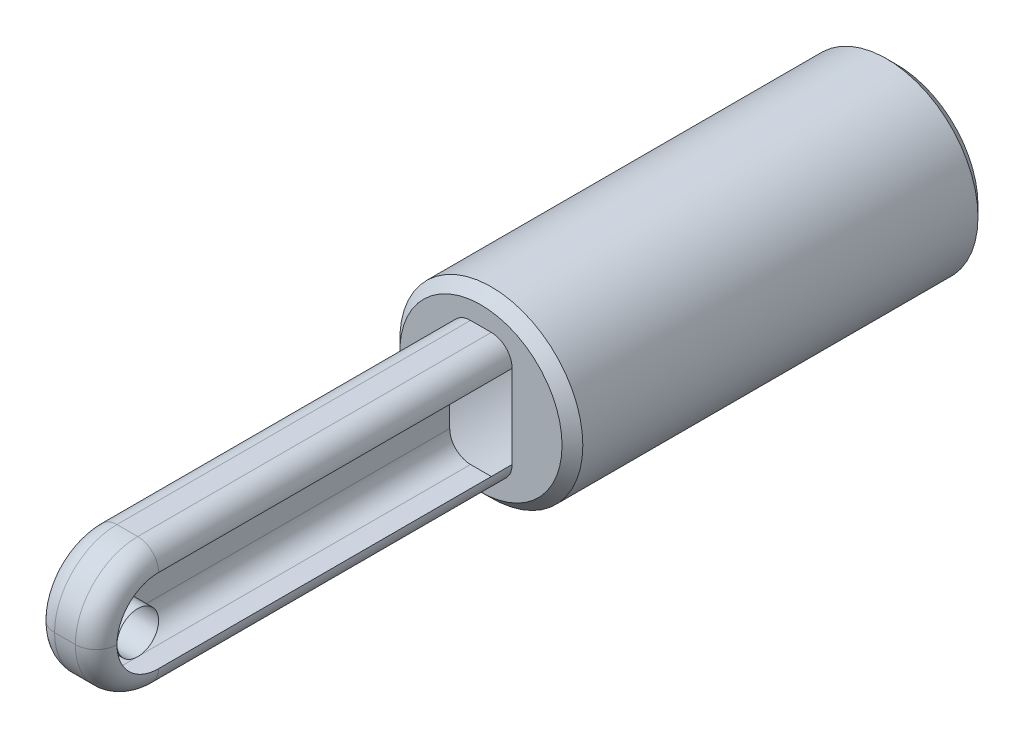
ISO-10303-21;
HEADER;
FILE_DESCRIPTION(('STEP AP214'),'2;1');
FILE_NAME('part.step','',(''),(''),'','','');
FILE_SCHEMA(('AUTOMOTIVE_DESIGN { 1 0 10303 214 1 1 1 1 }'));
ENDSEC;
DATA;
#1=APPLICATION_CONTEXT('core data for automotive mechanical design processes');
#2=APPLICATION_PROTOCOL_DEFINITION('international standard','automotive_design',2000,#1);
#3=PRODUCT_CONTEXT('',#1,'mechanical');
#4=PRODUCT('Part','Part','',(#3));
#5=PRODUCT_RELATED_PRODUCT_CATEGORY('part','',(#4));
#6=PRODUCT_DEFINITION_FORMATION('','',#4);
#7=PRODUCT_DEFINITION_CONTEXT('part definition',#1,'design');
#8=PRODUCT_DEFINITION('design','',#6,#7);
#9=PRODUCT_DEFINITION_SHAPE('','',#8);
#10=(LENGTH_UNIT() NAMED_UNIT(*) SI_UNIT(.MILLI.,.METRE.));
#11=(NAMED_UNIT(*) PLANE_ANGLE_UNIT() SI_UNIT($,.RADIAN.));
#12=(NAMED_UNIT(*) SI_UNIT($,.STERADIAN.) SOLID_ANGLE_UNIT());
#13=UNCERTAINTY_MEASURE_WITH_UNIT(LENGTH_MEASURE(1.E-05),#10,'distance_accuracy_value','');
#14=(GEOMETRIC_REPRESENTATION_CONTEXT(3) GLOBAL_UNCERTAINTY_ASSIGNED_CONTEXT((#13)) GLOBAL_UNIT_ASSIGNED_CONTEXT((#10,
#11,#12)) REPRESENTATION_CONTEXT('',''));
#15=CARTESIAN_POINT('',(0.,0.,0.));
#16=DIRECTION('',(0.,0.,1.));
#17=DIRECTION('',(1.,0.,0.));
#18=AXIS2_PLACEMENT_3D('',#15,#16,#17);
#19=CARTESIAN_POINT('',(0.,0.,0.));
#20=DIRECTION('',(0.,0.,1.));
#21=DIRECTION('',(1.,0.,0.));
#22=AXIS2_PLACEMENT_3D('',#19,#20,#21);
#23=PLANE('',#22);
#24=CARTESIAN_POINT('',(0.,0.,0.));
#25=DIRECTION('',(0.,0.,1.));
#26=DIRECTION('',(1.,0.,0.));
#27=AXIS2_PLACEMENT_3D('',#24,#25,#26);
#28=CIRCLE('',#27,19.5);
#29=CARTESIAN_POINT('',(19.5,0.,0.));
#30=VERTEX_POINT('',#29);
#31=EDGE_CURVE('E11',#30,#30,#28,.T.);
#32=ORIENTED_EDGE('',*,*,#31,.T.);
#33=EDGE_LOOP('',(#32));
#34=FACE_BOUND('',#33,.T.);
#35=DIRECTION('',(-1.,0.,0.));
#36=VECTOR('',#35,1.);
#37=CARTESIAN_POINT('',(7.5,15.,0.));
#38=LINE('',#37,#36);
#39=CARTESIAN_POINT('',(2.5,15.,0.));
#40=VERTEX_POINT('',#39);
#41=CARTESIAN_POINT('',(-2.5,15.,0.));
#42=VERTEX_POINT('',#41);
#43=EDGE_CURVE('E135',#40,#42,#38,.T.);
#44=ORIENTED_EDGE('',*,*,#43,.F.);
#45=CARTESIAN_POINT('',(2.5,10.,0.));
#46=DIRECTION('',(0.,0.,1.));
#47=DIRECTION('',(1.,0.,0.));
#48=AXIS2_PLACEMENT_3D('',#45,#46,#47);
#49=CIRCLE('',#48,5.);
#50=CARTESIAN_POINT('',(7.5,10.,0.));
#51=VERTEX_POINT('',#50);
#52=EDGE_CURVE('E165',#40,#51,#49,.F.);
#53=ORIENTED_EDGE('',*,*,#52,.T.);
#54=DIRECTION('',(0.,1.,0.));
#55=VECTOR('',#54,1.);
#56=CARTESIAN_POINT('',(7.5,15.,0.));
#57=LINE('',#56,#55);
#58=CARTESIAN_POINT('',(7.5,-10.,0.));
#59=VERTEX_POINT('',#58);
#60=EDGE_CURVE('E225',#59,#51,#57,.T.);
#61=ORIENTED_EDGE('',*,*,#60,.F.);
#62=CARTESIAN_POINT('',(2.5,-10.,0.));
#63=DIRECTION('',(0.,0.,1.));
#64=DIRECTION('',(1.,0.,0.));
#65=AXIS2_PLACEMENT_3D('',#62,#63,#64);
#66=CIRCLE('',#65,5.);
#67=CARTESIAN_POINT('',(2.5,-15.,0.));
#68=VERTEX_POINT('',#67);
#69=EDGE_CURVE('E200',#59,#68,#66,.F.);
#70=ORIENTED_EDGE('',*,*,#69,.T.);
#71=DIRECTION('',(-1.,0.,0.));
#72=VECTOR('',#71,1.);
#73=CARTESIAN_POINT('',(7.5,-15.,0.));
#74=LINE('',#73,#72);
#75=CARTESIAN_POINT('',(-2.5,-15.,0.));
#76=VERTEX_POINT('',#75);
#77=EDGE_CURVE('E121',#68,#76,#74,.T.);
#78=ORIENTED_EDGE('',*,*,#77,.T.);
#79=CARTESIAN_POINT('',(-2.5,-10.,0.));
#80=DIRECTION('',(0.,0.,1.));
#81=DIRECTION('',(1.,0.,0.));
#82=AXIS2_PLACEMENT_3D('',#79,#80,#81);
#83=CIRCLE('',#82,5.);
#84=CARTESIAN_POINT('',(-7.5,-10.,0.));
#85=VERTEX_POINT('',#84);
#86=EDGE_CURVE('E254',#76,#85,#83,.F.);
#87=ORIENTED_EDGE('',*,*,#86,.T.);
#88=DIRECTION('',(0.,1.,0.));
#89=VECTOR('',#88,1.);
#90=CARTESIAN_POINT('',(-7.5,15.,0.));
#91=LINE('',#90,#89);
#92=CARTESIAN_POINT('',(-7.5,10.,0.));
#93=VERTEX_POINT('',#92);
#94=EDGE_CURVE('E227',#85,#93,#91,.T.);
#95=ORIENTED_EDGE('',*,*,#94,.T.);
#96=CARTESIAN_POINT('',(-2.5,10.,0.));
#97=DIRECTION('',(0.,0.,1.));
#98=DIRECTION('',(1.,0.,0.));
#99=AXIS2_PLACEMENT_3D('',#96,#97,#98);
#100=CIRCLE('',#99,5.);
#101=EDGE_CURVE('E49',#93,#42,#100,.F.);
#102=ORIENTED_EDGE('',*,*,#101,.T.);
#103=EDGE_LOOP('',(#44,#53,#61,#70,#78,#87,#95,#102));
#104=FACE_BOUND('',#103,.T.);
#105=ADVANCED_FACE('F34',(#34,#104),#23,.T.);
#106=CARTESIAN_POINT('',(0.,0.,-100.));
#107=DIRECTION('',(0.,0.,1.));
#108=DIRECTION('',(1.,0.,0.));
#109=AXIS2_PLACEMENT_3D('',#106,#107,#108);
#110=CYLINDRICAL_SURFACE('',#109,22.);
#111=CARTESIAN_POINT('',(0.,0.,-97.5));
#112=DIRECTION('',(0.,0.,1.));
#113=DIRECTION('',(1.,0.,0.));
#114=AXIS2_PLACEMENT_3D('',#111,#112,#113);
#115=CIRCLE('',#114,22.);
#116=CARTESIAN_POINT('',(22.,0.,-97.5));
#117=VERTEX_POINT('',#116);
#118=EDGE_CURVE('E164',#117,#117,#115,.T.);
#119=ORIENTED_EDGE('',*,*,#118,.T.);
#120=EDGE_LOOP('',(#119));
#121=FACE_BOUND('',#120,.T.);
#122=CARTESIAN_POINT('',(0.,0.,-2.5));
#123=DIRECTION('',(0.,0.,1.));
#124=DIRECTION('',(1.,0.,0.));
#125=AXIS2_PLACEMENT_3D('',#122,#123,#124);
#126=CIRCLE('',#125,22.);
#127=CARTESIAN_POINT('',(22.,0.,-2.5));
#128=VERTEX_POINT('',#127);
#129=EDGE_CURVE('E161',#128,#128,#126,.F.);
#130=ORIENTED_EDGE('',*,*,#129,.T.);
#131=EDGE_LOOP('',(#130));
#132=FACE_BOUND('',#131,.T.);
#133=ADVANCED_FACE('F177',(#121,#132),#110,.T.);
#134=CARTESIAN_POINT('',(0.,0.,-100.));
#135=DIRECTION('',(0.,0.,1.));
#136=DIRECTION('',(1.,0.,0.));
#137=AXIS2_PLACEMENT_3D('',#134,#135,#136);
#138=PLANE('',#137);
#139=CARTESIAN_POINT('',(0.,0.,-100.));
#140=DIRECTION('',(0.,0.,1.));
#141=DIRECTION('',(1.,0.,0.));
#142=AXIS2_PLACEMENT_3D('',#139,#140,#141);
#143=CIRCLE('',#142,19.5);
#144=CARTESIAN_POINT('',(19.5,0.,-100.));
#145=VERTEX_POINT('',#144);
#146=EDGE_CURVE('E42',#145,#145,#143,.F.);
#147=ORIENTED_EDGE('',*,*,#146,.T.);
#148=EDGE_LOOP('',(#147));
#149=FACE_BOUND('',#148,.T.);
#150=ADVANCED_FACE('F170',(#149),#138,.F.);
#151=CARTESIAN_POINT('',(7.5,15.,0.));
#152=DIRECTION('',(0.,-1.,0.));
#153=DIRECTION('',(0.,0.,-1.));
#154=AXIS2_PLACEMENT_3D('',#151,#152,#153);
#155=PLANE('',#154);
#156=ORIENTED_EDGE('',*,*,#43,.T.);
#157=DIRECTION('',(0.,0.,1.));
#158=VECTOR('',#157,1.);
#159=CARTESIAN_POINT('',(-2.5,15.,85.));
#160=LINE('',#159,#158);
#161=CARTESIAN_POINT('',(-2.5,15.,85.));
#162=VERTEX_POINT('',#161);
#163=EDGE_CURVE('E252',#42,#162,#160,.T.);
#164=ORIENTED_EDGE('',*,*,#163,.T.);
#165=DIRECTION('',(-1.,0.,0.));
#166=VECTOR('',#165,1.);
#167=CARTESIAN_POINT('',(7.5,15.,85.));
#168=LINE('',#167,#166);
#169=CARTESIAN_POINT('',(2.5,15.,85.));
#170=VERTEX_POINT('',#169);
#171=EDGE_CURVE('E125',#162,#170,#168,.F.);
#172=ORIENTED_EDGE('',*,*,#171,.T.);
#173=DIRECTION('',(0.,0.,1.));
#174=VECTOR('',#173,1.);
#175=CARTESIAN_POINT('',(2.5,15.,0.));
#176=LINE('',#175,#174);
#177=EDGE_CURVE('E56',#170,#40,#176,.F.);
#178=ORIENTED_EDGE('',*,*,#177,.T.);
#179=EDGE_LOOP('',(#156,#164,#172,#178));
#180=FACE_BOUND('',#179,.T.);
#181=ADVANCED_FACE('F264',(#180),#155,.F.);
#182=CARTESIAN_POINT('',(7.5,-15.,0.));
#183=DIRECTION('',(0.,1.,0.));
#184=DIRECTION('',(0.,0.,1.));
#185=AXIS2_PLACEMENT_3D('',#182,#183,#184);
#186=PLANE('',#185);
#187=DIRECTION('',(-1.,0.,0.));
#188=VECTOR('',#187,1.);
#189=CARTESIAN_POINT('',(7.5,-15.,85.));
#190=LINE('',#189,#188);
#191=CARTESIAN_POINT('',(2.5,-15.,85.));
#192=VERTEX_POINT('',#191);
#193=CARTESIAN_POINT('',(-2.5,-15.,85.));
#194=VERTEX_POINT('',#193);
#195=EDGE_CURVE('E118',#192,#194,#190,.T.);
#196=ORIENTED_EDGE('',*,*,#195,.T.);
#197=DIRECTION('',(0.,0.,-1.));
#198=VECTOR('',#197,1.);
#199=CARTESIAN_POINT('',(-2.5,-15.,0.));
#200=LINE('',#199,#198);
#201=EDGE_CURVE('E124',#194,#76,#200,.T.);
#202=ORIENTED_EDGE('',*,*,#201,.T.);
#203=ORIENTED_EDGE('',*,*,#77,.F.);
#204=DIRECTION('',(0.,0.,-1.));
#205=VECTOR('',#204,1.);
#206=CARTESIAN_POINT('',(2.5,-15.,0.));
#207=LINE('',#206,#205);
#208=EDGE_CURVE('E114',#68,#192,#207,.F.);
#209=ORIENTED_EDGE('',*,*,#208,.T.);
#210=EDGE_LOOP('',(#196,#202,#203,#209));
#211=FACE_BOUND('',#210,.T.);
#212=ADVANCED_FACE('F116',(#211),#186,.F.);
#213=CARTESIAN_POINT('',(7.5,0.,0.));
#214=DIRECTION('',(-1.,0.,0.));
#215=DIRECTION('',(0.,0.,1.));
#216=AXIS2_PLACEMENT_3D('',#213,#214,#215);
#217=PLANE('',#216);
#218=CARTESIAN_POINT('',(7.5,0.,85.));
#219=DIRECTION('',(-1.,0.,0.));
#220=DIRECTION('',(0.,0.,1.));
#221=AXIS2_PLACEMENT_3D('',#218,#219,#220);
#222=CIRCLE('',#221,10.);
#223=CARTESIAN_POINT('',(7.5,0.,95.));
#224=VERTEX_POINT('',#223);
#225=CARTESIAN_POINT('',(7.5,-10.,85.));
#226=VERTEX_POINT('',#225);
#227=EDGE_CURVE('E248',#224,#226,#222,.F.);
#228=ORIENTED_EDGE('',*,*,#227,.T.);
#229=DIRECTION('',(0.,0.,-1.));
#230=VECTOR('',#229,1.);
#231=CARTESIAN_POINT('',(7.5,-10.,0.));
#232=LINE('',#231,#230);
#233=EDGE_CURVE('E150',#226,#59,#232,.T.);
#234=ORIENTED_EDGE('',*,*,#233,.T.);
#235=ORIENTED_EDGE('',*,*,#60,.T.);
#236=DIRECTION('',(0.,0.,1.));
#237=VECTOR('',#236,1.);
#238=CARTESIAN_POINT('',(7.5,10.,0.));
#239=LINE('',#238,#237);
#240=CARTESIAN_POINT('',(7.5,9.99999999999999,85.));
#241=VERTEX_POINT('',#240);
#242=EDGE_CURVE('E198',#51,#241,#239,.T.);
#243=ORIENTED_EDGE('',*,*,#242,.T.);
#244=CARTESIAN_POINT('',(7.5,0.,85.));
#245=DIRECTION('',(-1.,0.,0.));
#246=DIRECTION('',(0.,0.,1.));
#247=AXIS2_PLACEMENT_3D('',#244,#245,#246);
#248=CIRCLE('',#247,10.);
#249=EDGE_CURVE('E246',#241,#224,#248,.F.);
#250=ORIENTED_EDGE('',*,*,#249,.T.);
#251=CARTESIAN_POINT('',(7.5,0.,90.));
#252=DIRECTION('',(1.,0.,0.));
#253=DIRECTION('',(0.,0.,-1.));
#254=AXIS2_PLACEMENT_3D('',#251,#252,#253);
#255=CIRCLE('',#254,5.);
#256=EDGE_CURVE('E211',#224,#224,#255,.T.);
#257=ORIENTED_EDGE('',*,*,#256,.F.);
#258=EDGE_LOOP('',(#228,#234,#235,#243,#250,#257));
#259=FACE_BOUND('',#258,.T.);
#260=ADVANCED_FACE('F256',(#259),#217,.F.);
#261=CARTESIAN_POINT('',(-7.5,0.,0.));
#262=DIRECTION('',(-1.,0.,0.));
#263=DIRECTION('',(0.,0.,1.));
#264=AXIS2_PLACEMENT_3D('',#261,#262,#263);
#265=PLANE('',#264);
#266=ORIENTED_EDGE('',*,*,#94,.F.);
#267=DIRECTION('',(0.,0.,-1.));
#268=VECTOR('',#267,1.);
#269=CARTESIAN_POINT('',(-7.5,-10.,85.));
#270=LINE('',#269,#268);
#271=CARTESIAN_POINT('',(-7.5,-10.,85.));
#272=VERTEX_POINT('',#271);
#273=EDGE_CURVE('E146',#85,#272,#270,.F.);
#274=ORIENTED_EDGE('',*,*,#273,.T.);
#275=CARTESIAN_POINT('',(-7.5,0.,85.));
#276=DIRECTION('',(-1.,0.,0.));
#277=DIRECTION('',(0.,0.,1.));
#278=AXIS2_PLACEMENT_3D('',#275,#276,#277);
#279=CIRCLE('',#278,10.);
#280=CARTESIAN_POINT('',(-7.5,0.,95.));
#281=VERTEX_POINT('',#280);
#282=EDGE_CURVE('E237',#272,#281,#279,.T.);
#283=ORIENTED_EDGE('',*,*,#282,.T.);
#284=CARTESIAN_POINT('',(-7.5,0.,90.));
#285=DIRECTION('',(-1.,0.,0.));
#286=DIRECTION('',(0.,0.,1.));
#287=AXIS2_PLACEMENT_3D('',#284,#285,#286);
#288=CIRCLE('',#287,5.);
#289=EDGE_CURVE('E217',#281,#281,#288,.T.);
#290=ORIENTED_EDGE('',*,*,#289,.F.);
#291=CARTESIAN_POINT('',(-7.5,0.,85.));
#292=DIRECTION('',(-1.,0.,0.));
#293=DIRECTION('',(0.,0.,1.));
#294=AXIS2_PLACEMENT_3D('',#291,#292,#293);
#295=CIRCLE('',#294,10.);
#296=CARTESIAN_POINT('',(-7.5,9.99999999999999,85.));
#297=VERTEX_POINT('',#296);
#298=EDGE_CURVE('E235',#281,#297,#295,.T.);
#299=ORIENTED_EDGE('',*,*,#298,.T.);
#300=DIRECTION('',(0.,0.,1.));
#301=VECTOR('',#300,1.);
#302=CARTESIAN_POINT('',(-7.5,10.,0.));
#303=LINE('',#302,#301);
#304=EDGE_CURVE('E233',#297,#93,#303,.F.);
#305=ORIENTED_EDGE('',*,*,#304,.T.);
#306=EDGE_LOOP('',(#266,#274,#283,#290,#299,#305));
#307=FACE_BOUND('',#306,.T.);
#308=ADVANCED_FACE('F276',(#307),#265,.T.);
#309=CARTESIAN_POINT('',(7.5,0.,85.));
#310=DIRECTION('',(-1.,0.,0.));
#311=DIRECTION('',(0.,0.,1.));
#312=AXIS2_PLACEMENT_3D('',#309,#310,#311);
#313=CYLINDRICAL_SURFACE('',#312,15.);
#314=ORIENTED_EDGE('',*,*,#171,.F.);
#315=CARTESIAN_POINT('',(-2.5,0.,85.));
#316=DIRECTION('',(-1.,0.,0.));
#317=DIRECTION('',(0.,0.,1.));
#318=AXIS2_PLACEMENT_3D('',#315,#316,#317);
#319=CIRCLE('',#318,15.);
#320=CARTESIAN_POINT('',(-2.5,0.,100.));
#321=VERTEX_POINT('',#320);
#322=EDGE_CURVE('E243',#162,#321,#319,.F.);
#323=ORIENTED_EDGE('',*,*,#322,.T.);
#324=DIRECTION('',(-1.,0.,0.));
#325=VECTOR('',#324,1.);
#326=CARTESIAN_POINT('',(7.5,0.,100.));
#327=LINE('',#326,#325);
#328=CARTESIAN_POINT('',(2.5,0.,100.));
#329=VERTEX_POINT('',#328);
#330=EDGE_CURVE('E222',#329,#321,#327,.T.);
#331=ORIENTED_EDGE('',*,*,#330,.F.);
#332=CARTESIAN_POINT('',(2.5,0.,85.));
#333=DIRECTION('',(-1.,0.,0.));
#334=DIRECTION('',(0.,0.,1.));
#335=AXIS2_PLACEMENT_3D('',#332,#333,#334);
#336=CIRCLE('',#335,15.);
#337=EDGE_CURVE('E241',#329,#170,#336,.T.);
#338=ORIENTED_EDGE('',*,*,#337,.T.);
#339=EDGE_LOOP('',(#314,#323,#331,#338));
#340=FACE_BOUND('',#339,.T.);
#341=ADVANCED_FACE('F263',(#340),#313,.T.);
#342=CARTESIAN_POINT('',(7.5,0.,85.));
#343=DIRECTION('',(-1.,0.,0.));
#344=DIRECTION('',(0.,0.,1.));
#345=AXIS2_PLACEMENT_3D('',#342,#343,#344);
#346=CYLINDRICAL_SURFACE('',#345,15.);
#347=ORIENTED_EDGE('',*,*,#330,.T.);
#348=CARTESIAN_POINT('',(-2.5,0.,85.));
#349=DIRECTION('',(-1.,0.,0.));
#350=DIRECTION('',(0.,0.,1.));
#351=AXIS2_PLACEMENT_3D('',#348,#349,#350);
#352=CIRCLE('',#351,15.);
#353=EDGE_CURVE('E134',#321,#194,#352,.F.);
#354=ORIENTED_EDGE('',*,*,#353,.T.);
#355=ORIENTED_EDGE('',*,*,#195,.F.);
#356=CARTESIAN_POINT('',(2.5,0.,85.));
#357=DIRECTION('',(-1.,0.,0.));
#358=DIRECTION('',(0.,0.,1.));
#359=AXIS2_PLACEMENT_3D('',#356,#357,#358);
#360=CIRCLE('',#359,15.);
#361=EDGE_CURVE('E131',#192,#329,#360,.T.);
#362=ORIENTED_EDGE('',*,*,#361,.T.);
#363=EDGE_LOOP('',(#347,#354,#355,#362));
#364=FACE_BOUND('',#363,.T.);
#365=ADVANCED_FACE('F130',(#364),#346,.T.);
#366=CARTESIAN_POINT('',(-22.,0.,90.));
#367=DIRECTION('',(1.,0.,0.));
#368=DIRECTION('',(0.,0.,-1.));
#369=AXIS2_PLACEMENT_3D('',#366,#367,#368);
#370=CYLINDRICAL_SURFACE('',#369,5.);
#371=ORIENTED_EDGE('',*,*,#289,.T.);
#372=EDGE_LOOP('',(#371));
#373=FACE_BOUND('',#372,.T.);
#374=ORIENTED_EDGE('',*,*,#256,.T.);
#375=EDGE_LOOP('',(#374));
#376=FACE_BOUND('',#375,.T.);
#377=ADVANCED_FACE('F279',(#373,#376),#370,.F.);
#378=CARTESIAN_POINT('',(-2.5,10.,0.));
#379=DIRECTION('',(0.,0.,-1.));
#380=DIRECTION('',(0.,1.,0.));
#381=AXIS2_PLACEMENT_3D('',#378,#379,#380);
#382=CYLINDRICAL_SURFACE('',#381,5.);
#383=ORIENTED_EDGE('',*,*,#101,.F.);
#384=ORIENTED_EDGE('',*,*,#304,.F.);
#385=CARTESIAN_POINT('',(-2.5,9.99999999999999,85.));
#386=DIRECTION('',(0.,0.,1.));
#387=DIRECTION('',(1.,0.,0.));
#388=AXIS2_PLACEMENT_3D('',#385,#386,#387);
#389=CIRCLE('',#388,5.);
#390=EDGE_CURVE('E155',#162,#297,#389,.T.);
#391=ORIENTED_EDGE('',*,*,#390,.F.);
#392=ORIENTED_EDGE('',*,*,#163,.F.);
#393=EDGE_LOOP('',(#383,#384,#391,#392));
#394=FACE_BOUND('',#393,.T.);
#395=ADVANCED_FACE('F266',(#394),#382,.T.);
#396=CARTESIAN_POINT('',(-2.5,0.,85.));
#397=DIRECTION('',(-1.,0.,0.));
#398=DIRECTION('',(0.,0.,1.));
#399=AXIS2_PLACEMENT_3D('',#396,#397,#398);
#400=TOROIDAL_SURFACE('',#399,10.,5.);
#401=ORIENTED_EDGE('',*,*,#390,.T.);
#402=ORIENTED_EDGE('',*,*,#298,.F.);
#403=CARTESIAN_POINT('',(-2.5,0.,95.));
#404=DIRECTION('',(0.,-1.,0.));
#405=DIRECTION('',(1.,0.,0.));
#406=AXIS2_PLACEMENT_3D('',#403,#404,#405);
#407=CIRCLE('',#406,5.);
#408=EDGE_CURVE('E205',#321,#281,#407,.T.);
#409=ORIENTED_EDGE('',*,*,#408,.F.);
#410=ORIENTED_EDGE('',*,*,#322,.F.);
#411=EDGE_LOOP('',(#401,#402,#409,#410));
#412=FACE_BOUND('',#411,.T.);
#413=ADVANCED_FACE('F268',(#412),#400,.T.);
#414=CARTESIAN_POINT('',(-2.5,0.,85.));
#415=DIRECTION('',(-1.,0.,0.));
#416=DIRECTION('',(0.,0.,1.));
#417=AXIS2_PLACEMENT_3D('',#414,#415,#416);
#418=TOROIDAL_SURFACE('',#417,10.,5.);
#419=ORIENTED_EDGE('',*,*,#408,.T.);
#420=ORIENTED_EDGE('',*,*,#282,.F.);
#421=CARTESIAN_POINT('',(-2.5,-10.,85.));
#422=DIRECTION('',(0.,0.,-1.));
#423=DIRECTION('',(-1.,0.,0.));
#424=AXIS2_PLACEMENT_3D('',#421,#422,#423);
#425=CIRCLE('',#424,5.);
#426=EDGE_CURVE('E160',#194,#272,#425,.T.);
#427=ORIENTED_EDGE('',*,*,#426,.F.);
#428=ORIENTED_EDGE('',*,*,#353,.F.);
#429=EDGE_LOOP('',(#419,#420,#427,#428));
#430=FACE_BOUND('',#429,.T.);
#431=ADVANCED_FACE('F269',(#430),#418,.T.);
#432=CARTESIAN_POINT('',(-2.5,-10.,0.));
#433=DIRECTION('',(0.,0.,1.));
#434=DIRECTION('',(0.,-1.,0.));
#435=AXIS2_PLACEMENT_3D('',#432,#433,#434);
#436=CYLINDRICAL_SURFACE('',#435,5.);
#437=ORIENTED_EDGE('',*,*,#426,.T.);
#438=ORIENTED_EDGE('',*,*,#273,.F.);
#439=ORIENTED_EDGE('',*,*,#86,.F.);
#440=ORIENTED_EDGE('',*,*,#201,.F.);
#441=EDGE_LOOP('',(#437,#438,#439,#440));
#442=FACE_BOUND('',#441,.T.);
#443=ADVANCED_FACE('F273',(#442),#436,.T.);
#444=CARTESIAN_POINT('',(2.5,10.,0.));
#445=DIRECTION('',(0.,0.,1.));
#446=DIRECTION('',(0.,-1.,0.));
#447=AXIS2_PLACEMENT_3D('',#444,#445,#446);
#448=CYLINDRICAL_SURFACE('',#447,5.);
#449=ORIENTED_EDGE('',*,*,#52,.F.);
#450=ORIENTED_EDGE('',*,*,#177,.F.);
#451=CARTESIAN_POINT('',(2.5,9.99999999999999,85.));
#452=DIRECTION('',(0.,0.,1.));
#453=DIRECTION('',(1.,0.,0.));
#454=AXIS2_PLACEMENT_3D('',#451,#452,#453);
#455=CIRCLE('',#454,5.);
#456=EDGE_CURVE('E152',#241,#170,#455,.T.);
#457=ORIENTED_EDGE('',*,*,#456,.F.);
#458=ORIENTED_EDGE('',*,*,#242,.F.);
#459=EDGE_LOOP('',(#449,#450,#457,#458));
#460=FACE_BOUND('',#459,.T.);
#461=ADVANCED_FACE('F196',(#460),#448,.T.);
#462=CARTESIAN_POINT('',(2.5,0.,85.));
#463=DIRECTION('',(-1.,0.,0.));
#464=DIRECTION('',(0.,0.,1.));
#465=AXIS2_PLACEMENT_3D('',#462,#463,#464);
#466=TOROIDAL_SURFACE('',#465,10.,5.);
#467=ORIENTED_EDGE('',*,*,#456,.T.);
#468=ORIENTED_EDGE('',*,*,#337,.F.);
#469=CARTESIAN_POINT('',(2.5,0.,95.));
#470=DIRECTION('',(0.,-1.,0.));
#471=DIRECTION('',(0.,0.,-1.));
#472=AXIS2_PLACEMENT_3D('',#469,#470,#471);
#473=CIRCLE('',#472,5.);
#474=EDGE_CURVE('E145',#224,#329,#473,.T.);
#475=ORIENTED_EDGE('',*,*,#474,.F.);
#476=ORIENTED_EDGE('',*,*,#249,.F.);
#477=EDGE_LOOP('',(#467,#468,#475,#476));
#478=FACE_BOUND('',#477,.T.);
#479=ADVANCED_FACE('F260',(#478),#466,.T.);
#480=CARTESIAN_POINT('',(2.5,0.,85.));
#481=DIRECTION('',(-1.,0.,0.));
#482=DIRECTION('',(0.,0.,1.));
#483=AXIS2_PLACEMENT_3D('',#480,#481,#482);
#484=TOROIDAL_SURFACE('',#483,10.,5.);
#485=ORIENTED_EDGE('',*,*,#474,.T.);
#486=ORIENTED_EDGE('',*,*,#361,.F.);
#487=CARTESIAN_POINT('',(2.5,-10.,85.));
#488=DIRECTION('',(0.,0.,-1.));
#489=DIRECTION('',(-1.,0.,0.));
#490=AXIS2_PLACEMENT_3D('',#487,#488,#489);
#491=CIRCLE('',#490,5.);
#492=EDGE_CURVE('E142',#226,#192,#491,.T.);
#493=ORIENTED_EDGE('',*,*,#492,.F.);
#494=ORIENTED_EDGE('',*,*,#227,.F.);
#495=EDGE_LOOP('',(#485,#486,#493,#494));
#496=FACE_BOUND('',#495,.T.);
#497=ADVANCED_FACE('F140',(#496),#484,.T.);
#498=CARTESIAN_POINT('',(2.5,-10.,0.));
#499=DIRECTION('',(0.,0.,-1.));
#500=DIRECTION('',(0.,1.,0.));
#501=AXIS2_PLACEMENT_3D('',#498,#499,#500);
#502=CYLINDRICAL_SURFACE('',#501,5.);
#503=ORIENTED_EDGE('',*,*,#492,.T.);
#504=ORIENTED_EDGE('',*,*,#208,.F.);
#505=ORIENTED_EDGE('',*,*,#69,.F.);
#506=ORIENTED_EDGE('',*,*,#233,.F.);
#507=EDGE_LOOP('',(#503,#504,#505,#506));
#508=FACE_BOUND('',#507,.T.);
#509=ADVANCED_FACE('F148',(#508),#502,.T.);
#510=CARTESIAN_POINT('',(0.,0.,-97.5));
#511=DIRECTION('',(0.,0.,1.));
#512=DIRECTION('',(1.,0.,0.));
#513=AXIS2_PLACEMENT_3D('',#510,#511,#512);
#514=CONICAL_SURFACE('',#513,22.,0.785398163397448);
#515=ORIENTED_EDGE('',*,*,#146,.F.);
#516=EDGE_LOOP('',(#515));
#517=FACE_BOUND('',#516,.T.);
#518=ORIENTED_EDGE('',*,*,#118,.F.);
#519=EDGE_LOOP('',(#518));
#520=FACE_BOUND('',#519,.T.);
#521=ADVANCED_FACE('F172',(#517,#520),#514,.T.);
#522=CARTESIAN_POINT('',(0.,0.,0.));
#523=DIRECTION('',(0.,0.,-1.));
#524=DIRECTION('',(-1.,0.,0.));
#525=AXIS2_PLACEMENT_3D('',#522,#523,#524);
#526=CONICAL_SURFACE('',#525,19.5,0.78539816339745);
#527=ORIENTED_EDGE('',*,*,#129,.F.);
#528=EDGE_LOOP('',(#527));
#529=FACE_BOUND('',#528,.T.);
#530=ORIENTED_EDGE('',*,*,#31,.F.);
#531=EDGE_LOOP('',(#530));
#532=FACE_BOUND('',#531,.T.);
#533=ADVANCED_FACE('F36',(#529,#532),#526,.T.);
#534=CLOSED_SHELL('',(#105,#133,#150,#181,#212,#260,#308,#341,#365,#377,#395,#413,#431,#443,
#461,#479,#497,#509,#521,#533));
#535=MANIFOLD_SOLID_BREP('B2',#534);
#536=ADVANCED_BREP_SHAPE_REPRESENTATION('',(#18,#535),#14);
#537=SHAPE_DEFINITION_REPRESENTATION(#9,#536);
ENDSEC;
END-ISO-10303-21;
